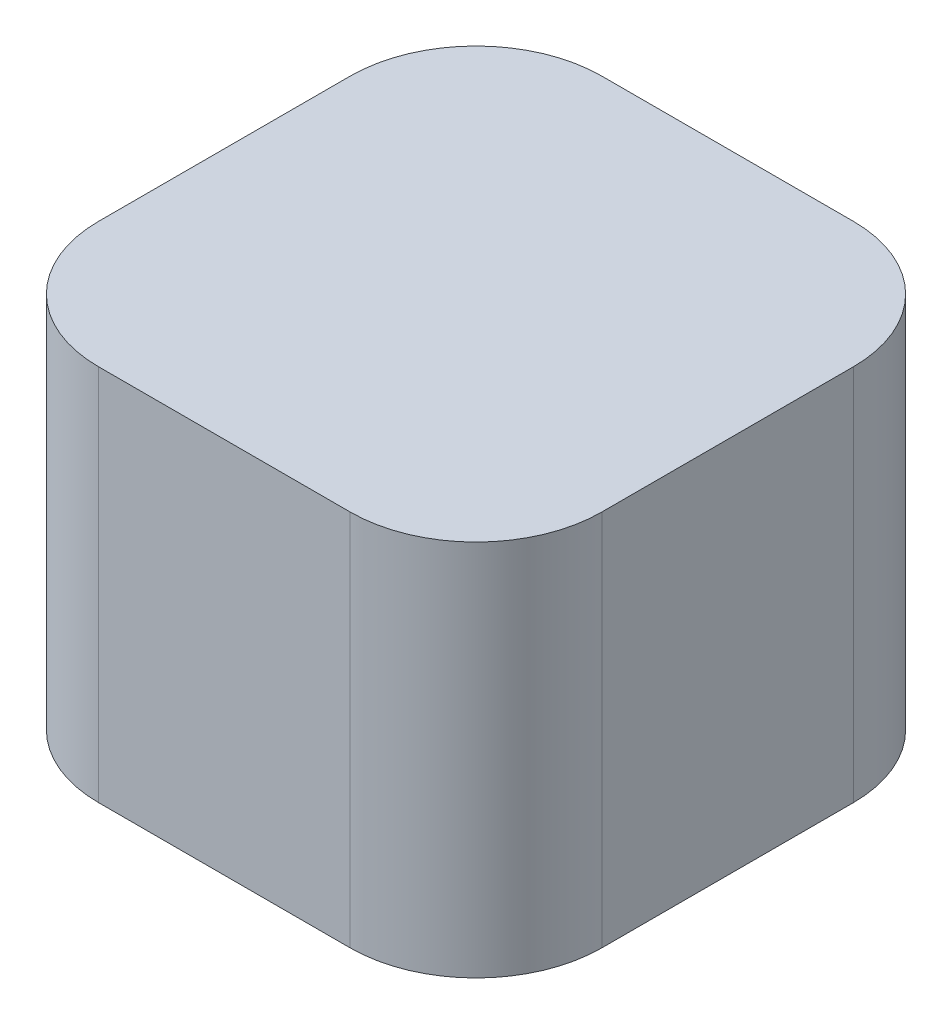
ISO-10303-21;
HEADER;
FILE_DESCRIPTION(('STEP AP214'),'2;1');
FILE_NAME('part.step','',(''),(''),'','','');
FILE_SCHEMA(('AUTOMOTIVE_DESIGN { 1 0 10303 214 1 1 1 1 }'));
ENDSEC;
DATA;
#1=APPLICATION_CONTEXT('core data for automotive mechanical design processes');
#2=APPLICATION_PROTOCOL_DEFINITION('international standard','automotive_design',2000,#1);
#3=PRODUCT_CONTEXT('',#1,'mechanical');
#4=PRODUCT('Part','Part','',(#3));
#5=PRODUCT_RELATED_PRODUCT_CATEGORY('part','',(#4));
#6=PRODUCT_DEFINITION_FORMATION('','',#4);
#7=PRODUCT_DEFINITION_CONTEXT('part definition',#1,'design');
#8=PRODUCT_DEFINITION('design','',#6,#7);
#9=PRODUCT_DEFINITION_SHAPE('','',#8);
#10=(LENGTH_UNIT() NAMED_UNIT(*) SI_UNIT(.MILLI.,.METRE.));
#11=(NAMED_UNIT(*) PLANE_ANGLE_UNIT() SI_UNIT($,.RADIAN.));
#12=(NAMED_UNIT(*) SI_UNIT($,.STERADIAN.) SOLID_ANGLE_UNIT());
#13=UNCERTAINTY_MEASURE_WITH_UNIT(LENGTH_MEASURE(1.E-05),#10,'distance_accuracy_value','');
#14=(GEOMETRIC_REPRESENTATION_CONTEXT(3) GLOBAL_UNCERTAINTY_ASSIGNED_CONTEXT((#13)) GLOBAL_UNIT_ASSIGNED_CONTEXT((#10,
#11,#12)) REPRESENTATION_CONTEXT('',''));
#15=CARTESIAN_POINT('',(0.,0.,0.));
#16=DIRECTION('',(0.,0.,1.));
#17=DIRECTION('',(1.,0.,0.));
#18=AXIS2_PLACEMENT_3D('',#15,#16,#17);
#19=CARTESIAN_POINT('',(9.99999999999999,30.,-10.));
#20=DIRECTION('',(0.,-1.,0.));
#21=DIRECTION('',(0.,0.,-1.));
#22=AXIS2_PLACEMENT_3D('',#19,#20,#21);
#23=CYLINDRICAL_SURFACE('',#22,10.);
#24=CARTESIAN_POINT('',(9.99999999999999,0.,-10.));
#25=DIRECTION('',(0.,1.,0.));
#26=DIRECTION('',(0.,0.,-1.));
#27=AXIS2_PLACEMENT_3D('',#24,#25,#26);
#28=CIRCLE('',#27,10.);
#29=CARTESIAN_POINT('',(0.,0.,-10.0000000000001));
#30=VERTEX_POINT('',#29);
#31=CARTESIAN_POINT('',(10.0000000000001,0.,0.));
#32=VERTEX_POINT('',#31);
#33=EDGE_CURVE('E140',#30,#32,#28,.T.);
#34=ORIENTED_EDGE('',*,*,#33,.T.);
#35=DIRECTION('',(0.,-1.,0.));
#36=VECTOR('',#35,1.);
#37=CARTESIAN_POINT('',(10.0000000000001,30.,0.));
#38=LINE('',#37,#36);
#39=CARTESIAN_POINT('',(10.0000000000001,30.,0.));
#40=VERTEX_POINT('',#39);
#41=EDGE_CURVE('E11',#40,#32,#38,.T.);
#42=ORIENTED_EDGE('',*,*,#41,.F.);
#43=CARTESIAN_POINT('',(9.99999999999999,30.,-10.));
#44=DIRECTION('',(0.,1.,0.));
#45=DIRECTION('',(0.,0.,-1.));
#46=AXIS2_PLACEMENT_3D('',#43,#44,#45);
#47=CIRCLE('',#46,10.);
#48=CARTESIAN_POINT('',(0.,30.,-10.0000000000001));
#49=VERTEX_POINT('',#48);
#50=EDGE_CURVE('E162',#49,#40,#47,.T.);
#51=ORIENTED_EDGE('',*,*,#50,.F.);
#52=DIRECTION('',(0.,-1.,0.));
#53=VECTOR('',#52,1.);
#54=CARTESIAN_POINT('',(0.,30.,-10.0000000000001));
#55=LINE('',#54,#53);
#56=EDGE_CURVE('E136',#49,#30,#55,.T.);
#57=ORIENTED_EDGE('',*,*,#56,.T.);
#58=EDGE_LOOP('',(#34,#42,#51,#57));
#59=FACE_BOUND('',#58,.T.);
#60=ADVANCED_FACE('F39',(#59),#23,.T.);
#61=CARTESIAN_POINT('',(10.0000000000001,30.,0.));
#62=DIRECTION('',(0.,0.,-1.));
#63=DIRECTION('',(-1.,0.,0.));
#64=AXIS2_PLACEMENT_3D('',#61,#62,#63);
#65=PLANE('',#64);
#66=DIRECTION('',(1.,0.,0.));
#67=VECTOR('',#66,1.);
#68=CARTESIAN_POINT('',(10.0000000000001,0.,0.));
#69=LINE('',#68,#67);
#70=CARTESIAN_POINT('',(29.9999999999999,0.,0.));
#71=VERTEX_POINT('',#70);
#72=EDGE_CURVE('E144',#32,#71,#69,.T.);
#73=ORIENTED_EDGE('',*,*,#72,.T.);
#74=DIRECTION('',(0.,-1.,0.));
#75=VECTOR('',#74,1.);
#76=CARTESIAN_POINT('',(29.9999999999999,30.,0.));
#77=LINE('',#76,#75);
#78=CARTESIAN_POINT('',(29.9999999999999,30.,0.));
#79=VERTEX_POINT('',#78);
#80=EDGE_CURVE('E48',#79,#71,#77,.T.);
#81=ORIENTED_EDGE('',*,*,#80,.F.);
#82=DIRECTION('',(1.,0.,0.));
#83=VECTOR('',#82,1.);
#84=CARTESIAN_POINT('',(10.0000000000001,30.,0.));
#85=LINE('',#84,#83);
#86=EDGE_CURVE('E99',#40,#79,#85,.T.);
#87=ORIENTED_EDGE('',*,*,#86,.F.);
#88=ORIENTED_EDGE('',*,*,#41,.T.);
#89=EDGE_LOOP('',(#73,#81,#87,#88));
#90=FACE_BOUND('',#89,.T.);
#91=ADVANCED_FACE('F208',(#90),#65,.F.);
#92=CARTESIAN_POINT('',(30.,30.,-10.));
#93=DIRECTION('',(0.,-1.,0.));
#94=DIRECTION('',(0.,0.,-1.));
#95=AXIS2_PLACEMENT_3D('',#92,#93,#94);
#96=CYLINDRICAL_SURFACE('',#95,9.99999999999999);
#97=CARTESIAN_POINT('',(30.,0.,-10.));
#98=DIRECTION('',(0.,1.,0.));
#99=DIRECTION('',(0.,0.,1.));
#100=AXIS2_PLACEMENT_3D('',#97,#98,#99);
#101=CIRCLE('',#100,9.99999999999999);
#102=CARTESIAN_POINT('',(40.,0.,-10.0000000000001));
#103=VERTEX_POINT('',#102);
#104=EDGE_CURVE('E147',#71,#103,#101,.T.);
#105=ORIENTED_EDGE('',*,*,#104,.T.);
#106=DIRECTION('',(0.,-1.,0.));
#107=VECTOR('',#106,1.);
#108=CARTESIAN_POINT('',(40.,30.,-10.0000000000001));
#109=LINE('',#108,#107);
#110=CARTESIAN_POINT('',(40.,30.,-10.0000000000001));
#111=VERTEX_POINT('',#110);
#112=EDGE_CURVE('E173',#111,#103,#109,.T.);
#113=ORIENTED_EDGE('',*,*,#112,.F.);
#114=CARTESIAN_POINT('',(30.,30.,-10.));
#115=DIRECTION('',(0.,1.,0.));
#116=DIRECTION('',(0.,0.,1.));
#117=AXIS2_PLACEMENT_3D('',#114,#115,#116);
#118=CIRCLE('',#117,9.99999999999999);
#119=EDGE_CURVE('E183',#79,#111,#118,.T.);
#120=ORIENTED_EDGE('',*,*,#119,.F.);
#121=ORIENTED_EDGE('',*,*,#80,.T.);
#122=EDGE_LOOP('',(#105,#113,#120,#121));
#123=FACE_BOUND('',#122,.T.);
#124=ADVANCED_FACE('F181',(#123),#96,.T.);
#125=CARTESIAN_POINT('',(40.,30.,-10.0000000000001));
#126=DIRECTION('',(-1.,0.,0.));
#127=DIRECTION('',(0.,0.,1.));
#128=AXIS2_PLACEMENT_3D('',#125,#126,#127);
#129=PLANE('',#128);
#130=DIRECTION('',(0.,0.,-1.));
#131=VECTOR('',#130,1.);
#132=CARTESIAN_POINT('',(40.,0.,-10.0000000000001));
#133=LINE('',#132,#131);
#134=CARTESIAN_POINT('',(40.,0.,-29.9999999999999));
#135=VERTEX_POINT('',#134);
#136=EDGE_CURVE('E150',#103,#135,#133,.T.);
#137=ORIENTED_EDGE('',*,*,#136,.T.);
#138=DIRECTION('',(0.,-1.,0.));
#139=VECTOR('',#138,1.);
#140=CARTESIAN_POINT('',(40.,30.,-29.9999999999999));
#141=LINE('',#140,#139);
#142=CARTESIAN_POINT('',(40.,30.,-29.9999999999999));
#143=VERTEX_POINT('',#142);
#144=EDGE_CURVE('E169',#143,#135,#141,.T.);
#145=ORIENTED_EDGE('',*,*,#144,.F.);
#146=DIRECTION('',(0.,0.,-1.));
#147=VECTOR('',#146,1.);
#148=CARTESIAN_POINT('',(40.,30.,-10.0000000000001));
#149=LINE('',#148,#147);
#150=EDGE_CURVE('E196',#111,#143,#149,.T.);
#151=ORIENTED_EDGE('',*,*,#150,.F.);
#152=ORIENTED_EDGE('',*,*,#112,.T.);
#153=EDGE_LOOP('',(#137,#145,#151,#152));
#154=FACE_BOUND('',#153,.T.);
#155=ADVANCED_FACE('F191',(#154),#129,.F.);
#156=CARTESIAN_POINT('',(30.,30.,-30.));
#157=DIRECTION('',(0.,-1.,0.));
#158=DIRECTION('',(0.,0.,-1.));
#159=AXIS2_PLACEMENT_3D('',#156,#157,#158);
#160=CYLINDRICAL_SURFACE('',#159,10.);
#161=CARTESIAN_POINT('',(30.,0.,-30.));
#162=DIRECTION('',(0.,1.,0.));
#163=DIRECTION('',(0.,0.,-1.));
#164=AXIS2_PLACEMENT_3D('',#161,#162,#163);
#165=CIRCLE('',#164,10.);
#166=CARTESIAN_POINT('',(29.9999999999999,0.,-40.));
#167=VERTEX_POINT('',#166);
#168=EDGE_CURVE('E153',#135,#167,#165,.T.);
#169=ORIENTED_EDGE('',*,*,#168,.T.);
#170=DIRECTION('',(0.,-1.,0.));
#171=VECTOR('',#170,1.);
#172=CARTESIAN_POINT('',(29.9999999999999,30.,-40.));
#173=LINE('',#172,#171);
#174=CARTESIAN_POINT('',(29.9999999999999,30.,-40.));
#175=VERTEX_POINT('',#174);
#176=EDGE_CURVE('E129',#175,#167,#173,.T.);
#177=ORIENTED_EDGE('',*,*,#176,.F.);
#178=CARTESIAN_POINT('',(30.,30.,-30.));
#179=DIRECTION('',(0.,1.,0.));
#180=DIRECTION('',(0.,0.,-1.));
#181=AXIS2_PLACEMENT_3D('',#178,#179,#180);
#182=CIRCLE('',#181,10.);
#183=EDGE_CURVE('E118',#143,#175,#182,.T.);
#184=ORIENTED_EDGE('',*,*,#183,.F.);
#185=ORIENTED_EDGE('',*,*,#144,.T.);
#186=EDGE_LOOP('',(#169,#177,#184,#185));
#187=FACE_BOUND('',#186,.T.);
#188=ADVANCED_FACE('F194',(#187),#160,.T.);
#189=CARTESIAN_POINT('',(10.0000000000001,30.,-40.));
#190=DIRECTION('',(0.,0.,1.));
#191=DIRECTION('',(1.,0.,0.));
#192=AXIS2_PLACEMENT_3D('',#189,#190,#191);
#193=PLANE('',#192);
#194=DIRECTION('',(-1.,0.,0.));
#195=VECTOR('',#194,1.);
#196=CARTESIAN_POINT('',(10.0000000000001,0.,-40.));
#197=LINE('',#196,#195);
#198=CARTESIAN_POINT('',(10.0000000000001,0.,-40.));
#199=VERTEX_POINT('',#198);
#200=EDGE_CURVE('E127',#167,#199,#197,.T.);
#201=ORIENTED_EDGE('',*,*,#200,.T.);
#202=DIRECTION('',(0.,-1.,0.));
#203=VECTOR('',#202,1.);
#204=CARTESIAN_POINT('',(10.0000000000001,30.,-40.));
#205=LINE('',#204,#203);
#206=CARTESIAN_POINT('',(10.0000000000001,30.,-40.));
#207=VERTEX_POINT('',#206);
#208=EDGE_CURVE('E124',#207,#199,#205,.T.);
#209=ORIENTED_EDGE('',*,*,#208,.F.);
#210=DIRECTION('',(-1.,0.,0.));
#211=VECTOR('',#210,1.);
#212=CARTESIAN_POINT('',(10.0000000000001,30.,-40.));
#213=LINE('',#212,#211);
#214=EDGE_CURVE('E112',#175,#207,#213,.T.);
#215=ORIENTED_EDGE('',*,*,#214,.F.);
#216=ORIENTED_EDGE('',*,*,#176,.T.);
#217=EDGE_LOOP('',(#201,#209,#215,#216));
#218=FACE_BOUND('',#217,.T.);
#219=ADVANCED_FACE('F125',(#218),#193,.F.);
#220=CARTESIAN_POINT('',(9.99999999999999,30.,-30.));
#221=DIRECTION('',(0.,-1.,0.));
#222=DIRECTION('',(0.,0.,-1.));
#223=AXIS2_PLACEMENT_3D('',#220,#221,#222);
#224=CYLINDRICAL_SURFACE('',#223,10.);
#225=CARTESIAN_POINT('',(9.99999999999999,0.,-30.));
#226=DIRECTION('',(0.,1.,0.));
#227=DIRECTION('',(0.,0.,-1.));
#228=AXIS2_PLACEMENT_3D('',#225,#226,#227);
#229=CIRCLE('',#228,10.);
#230=CARTESIAN_POINT('',(0.,0.,-29.9999999999999));
#231=VERTEX_POINT('',#230);
#232=EDGE_CURVE('E85',#199,#231,#229,.T.);
#233=ORIENTED_EDGE('',*,*,#232,.T.);
#234=DIRECTION('',(0.,-1.,0.));
#235=VECTOR('',#234,1.);
#236=CARTESIAN_POINT('',(0.,30.,-29.9999999999999));
#237=LINE('',#236,#235);
#238=CARTESIAN_POINT('',(0.,30.,-29.9999999999999));
#239=VERTEX_POINT('',#238);
#240=EDGE_CURVE('E130',#239,#231,#237,.T.);
#241=ORIENTED_EDGE('',*,*,#240,.F.);
#242=CARTESIAN_POINT('',(9.99999999999999,30.,-30.));
#243=DIRECTION('',(0.,1.,0.));
#244=DIRECTION('',(0.,0.,-1.));
#245=AXIS2_PLACEMENT_3D('',#242,#243,#244);
#246=CIRCLE('',#245,10.);
#247=EDGE_CURVE('E116',#207,#239,#246,.T.);
#248=ORIENTED_EDGE('',*,*,#247,.F.);
#249=ORIENTED_EDGE('',*,*,#208,.T.);
#250=EDGE_LOOP('',(#233,#241,#248,#249));
#251=FACE_BOUND('',#250,.T.);
#252=ADVANCED_FACE('F132',(#251),#224,.T.);
#253=CARTESIAN_POINT('',(0.,30.,-10.0000000000001));
#254=DIRECTION('',(1.,0.,0.));
#255=DIRECTION('',(0.,0.,-1.));
#256=AXIS2_PLACEMENT_3D('',#253,#254,#255);
#257=PLANE('',#256);
#258=DIRECTION('',(0.,0.,1.));
#259=VECTOR('',#258,1.);
#260=CARTESIAN_POINT('',(0.,0.,-10.0000000000001));
#261=LINE('',#260,#259);
#262=EDGE_CURVE('E91',#231,#30,#261,.T.);
#263=ORIENTED_EDGE('',*,*,#262,.T.);
#264=ORIENTED_EDGE('',*,*,#56,.F.);
#265=DIRECTION('',(0.,0.,1.));
#266=VECTOR('',#265,1.);
#267=CARTESIAN_POINT('',(0.,30.,-10.0000000000001));
#268=LINE('',#267,#266);
#269=EDGE_CURVE('E56',#239,#49,#268,.T.);
#270=ORIENTED_EDGE('',*,*,#269,.F.);
#271=ORIENTED_EDGE('',*,*,#240,.T.);
#272=EDGE_LOOP('',(#263,#264,#270,#271));
#273=FACE_BOUND('',#272,.T.);
#274=ADVANCED_FACE('F224',(#273),#257,.F.);
#275=CARTESIAN_POINT('',(9.99999999999999,30.,-10.));
#276=DIRECTION('',(0.,-1.,0.));
#277=DIRECTION('',(0.,0.,-1.));
#278=AXIS2_PLACEMENT_3D('',#275,#276,#277);
#279=PLANE('',#278);
#280=ORIENTED_EDGE('',*,*,#50,.T.);
#281=ORIENTED_EDGE('',*,*,#86,.T.);
#282=ORIENTED_EDGE('',*,*,#119,.T.);
#283=ORIENTED_EDGE('',*,*,#150,.T.);
#284=ORIENTED_EDGE('',*,*,#183,.T.);
#285=ORIENTED_EDGE('',*,*,#214,.T.);
#286=ORIENTED_EDGE('',*,*,#247,.T.);
#287=ORIENTED_EDGE('',*,*,#269,.T.);
#288=EDGE_LOOP('',(#280,#281,#282,#283,#284,#285,#286,#287));
#289=FACE_BOUND('',#288,.T.);
#290=ADVANCED_FACE('F114',(#289),#279,.F.);
#291=CARTESIAN_POINT('',(9.99999999999999,0.,-10.));
#292=DIRECTION('',(0.,-1.,0.));
#293=DIRECTION('',(0.,0.,-1.));
#294=AXIS2_PLACEMENT_3D('',#291,#292,#293);
#295=PLANE('',#294);
#296=ORIENTED_EDGE('',*,*,#33,.F.);
#297=ORIENTED_EDGE('',*,*,#262,.F.);
#298=ORIENTED_EDGE('',*,*,#232,.F.);
#299=ORIENTED_EDGE('',*,*,#200,.F.);
#300=ORIENTED_EDGE('',*,*,#168,.F.);
#301=ORIENTED_EDGE('',*,*,#136,.F.);
#302=ORIENTED_EDGE('',*,*,#104,.F.);
#303=ORIENTED_EDGE('',*,*,#72,.F.);
#304=EDGE_LOOP('',(#296,#297,#298,#299,#300,#301,#302,#303));
#305=FACE_BOUND('',#304,.T.);
#306=ADVANCED_FACE('F187',(#305),#295,.T.);
#307=CLOSED_SHELL('',(#60,#91,#124,#155,#188,#219,#252,#274,#290,#306));
#308=MANIFOLD_SOLID_BREP('B2',#307);
#309=ADVANCED_BREP_SHAPE_REPRESENTATION('',(#18,#308),#14);
#310=SHAPE_DEFINITION_REPRESENTATION(#9,#309);
ENDSEC;
END-ISO-10303-21;
